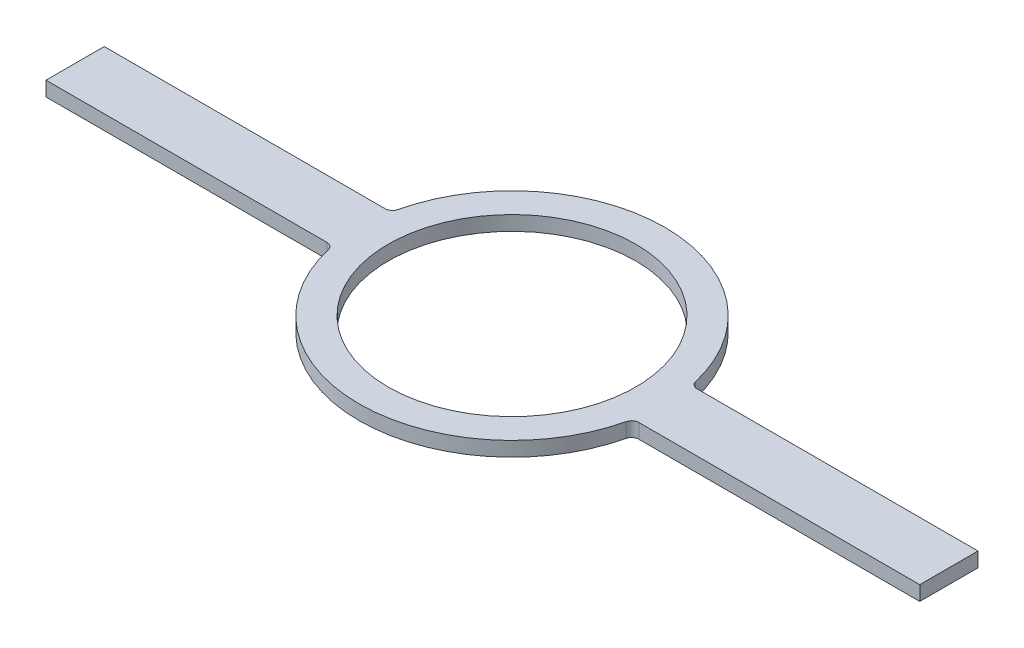
ISO-10303-21;
HEADER;
FILE_DESCRIPTION(('STEP AP214'),'2;1');
FILE_NAME('part.step','',(''),(''),'','','');
FILE_SCHEMA(('AUTOMOTIVE_DESIGN { 1 0 10303 214 1 1 1 1 }'));
ENDSEC;
DATA;
#1=APPLICATION_CONTEXT('core data for automotive mechanical design processes');
#2=APPLICATION_PROTOCOL_DEFINITION('international standard','automotive_design',2000,#1);
#3=PRODUCT_CONTEXT('',#1,'mechanical');
#4=PRODUCT('Part','Part','',(#3));
#5=PRODUCT_RELATED_PRODUCT_CATEGORY('part','',(#4));
#6=PRODUCT_DEFINITION_FORMATION('','',#4);
#7=PRODUCT_DEFINITION_CONTEXT('part definition',#1,'design');
#8=PRODUCT_DEFINITION('design','',#6,#7);
#9=PRODUCT_DEFINITION_SHAPE('','',#8);
#10=(LENGTH_UNIT() NAMED_UNIT(*) SI_UNIT(.MILLI.,.METRE.));
#11=(NAMED_UNIT(*) PLANE_ANGLE_UNIT() SI_UNIT($,.RADIAN.));
#12=(NAMED_UNIT(*) SI_UNIT($,.STERADIAN.) SOLID_ANGLE_UNIT());
#13=UNCERTAINTY_MEASURE_WITH_UNIT(LENGTH_MEASURE(1.E-05),#10,'distance_accuracy_value','');
#14=(GEOMETRIC_REPRESENTATION_CONTEXT(3) GLOBAL_UNCERTAINTY_ASSIGNED_CONTEXT((#13)) GLOBAL_UNIT_ASSIGNED_CONTEXT((#10,
#11,#12)) REPRESENTATION_CONTEXT('',''));
#15=CARTESIAN_POINT('',(0.,0.,0.));
#16=DIRECTION('',(0.,0.,1.));
#17=DIRECTION('',(1.,0.,0.));
#18=AXIS2_PLACEMENT_3D('',#15,#16,#17);
#19=CARTESIAN_POINT('',(0.,6.35,0.));
#20=DIRECTION('',(0.,1.,0.));
#21=DIRECTION('',(0.,0.,1.));
#22=AXIS2_PLACEMENT_3D('',#19,#20,#21);
#23=PLANE('',#22);
#24=CARTESIAN_POINT('',(0.,6.35,0.));
#25=DIRECTION('',(0.,1.,0.));
#26=DIRECTION('',(0.,0.,1.));
#27=AXIS2_PLACEMENT_3D('',#24,#25,#26);
#28=CIRCLE('',#27,66.675);
#29=CARTESIAN_POINT('',(-64.9301918826947,6.35,15.1534090909091));
#30=VERTEX_POINT('',#29);
#31=CARTESIAN_POINT('',(64.9301918826947,6.35,15.1534090909091));
#32=VERTEX_POINT('',#31);
#33=EDGE_CURVE('E264',#30,#32,#28,.T.);
#34=ORIENTED_EDGE('',*,*,#33,.T.);
#35=CARTESIAN_POINT('',(68.0221057818706,6.35,15.875));
#36=DIRECTION('',(0.,1.,0.));
#37=DIRECTION('',(0.,0.,1.));
#38=AXIS2_PLACEMENT_3D('',#35,#36,#37);
#39=CIRCLE('',#38,3.175);
#40=CARTESIAN_POINT('',(68.0221057818706,6.35,12.7));
#41=VERTEX_POINT('',#40);
#42=EDGE_CURVE('E129',#32,#41,#39,.F.);
#43=ORIENTED_EDGE('',*,*,#42,.T.);
#44=DIRECTION('',(1.,0.,0.));
#45=VECTOR('',#44,1.);
#46=CARTESIAN_POINT('',(65.4543018066803,6.35,12.7));
#47=LINE('',#46,#45);
#48=CARTESIAN_POINT('',(190.5,6.35,12.7));
#49=VERTEX_POINT('',#48);
#50=EDGE_CURVE('E121',#41,#49,#47,.T.);
#51=ORIENTED_EDGE('',*,*,#50,.T.);
#52=DIRECTION('',(0.,0.,-1.));
#53=VECTOR('',#52,1.);
#54=CARTESIAN_POINT('',(190.5,6.35,-12.7));
#55=LINE('',#54,#53);
#56=CARTESIAN_POINT('',(190.5,6.35,-12.7));
#57=VERTEX_POINT('',#56);
#58=EDGE_CURVE('E126',#49,#57,#55,.T.);
#59=ORIENTED_EDGE('',*,*,#58,.T.);
#60=DIRECTION('',(-1.,0.,0.));
#61=VECTOR('',#60,1.);
#62=CARTESIAN_POINT('',(65.4543018066804,6.35,-12.7));
#63=LINE('',#62,#61);
#64=CARTESIAN_POINT('',(68.0221057818707,6.35,-12.7));
#65=VERTEX_POINT('',#64);
#66=EDGE_CURVE('E143',#57,#65,#63,.T.);
#67=ORIENTED_EDGE('',*,*,#66,.T.);
#68=CARTESIAN_POINT('',(68.0221057818707,6.35,-15.875));
#69=DIRECTION('',(0.,1.,0.));
#70=DIRECTION('',(0.,0.,1.));
#71=AXIS2_PLACEMENT_3D('',#68,#69,#70);
#72=CIRCLE('',#71,3.175);
#73=CARTESIAN_POINT('',(64.9301918826947,6.35,-15.1534090909091));
#74=VERTEX_POINT('',#73);
#75=EDGE_CURVE('E178',#65,#74,#72,.F.);
#76=ORIENTED_EDGE('',*,*,#75,.T.);
#77=CARTESIAN_POINT('',(0.,6.35,0.));
#78=DIRECTION('',(0.,1.,0.));
#79=DIRECTION('',(0.,0.,1.));
#80=AXIS2_PLACEMENT_3D('',#77,#78,#79);
#81=CIRCLE('',#80,66.675);
#82=CARTESIAN_POINT('',(-64.9301918826947,6.35,-15.1534090909091));
#83=VERTEX_POINT('',#82);
#84=EDGE_CURVE('E252',#74,#83,#81,.T.);
#85=ORIENTED_EDGE('',*,*,#84,.T.);
#86=CARTESIAN_POINT('',(-68.0221057818707,6.35,-15.875));
#87=DIRECTION('',(0.,1.,0.));
#88=DIRECTION('',(0.,0.,1.));
#89=AXIS2_PLACEMENT_3D('',#86,#87,#88);
#90=CIRCLE('',#89,3.175);
#91=CARTESIAN_POINT('',(-68.0221057818707,6.35,-12.7));
#92=VERTEX_POINT('',#91);
#93=EDGE_CURVE('E174',#83,#92,#90,.F.);
#94=ORIENTED_EDGE('',*,*,#93,.T.);
#95=DIRECTION('',(-1.,0.,0.));
#96=VECTOR('',#95,1.);
#97=CARTESIAN_POINT('',(-190.5,6.35,-12.7));
#98=LINE('',#97,#96);
#99=CARTESIAN_POINT('',(-190.5,6.35,-12.7));
#100=VERTEX_POINT('',#99);
#101=EDGE_CURVE('E249',#92,#100,#98,.T.);
#102=ORIENTED_EDGE('',*,*,#101,.T.);
#103=DIRECTION('',(0.,0.,1.));
#104=VECTOR('',#103,1.);
#105=CARTESIAN_POINT('',(-190.5,6.35,-12.7));
#106=LINE('',#105,#104);
#107=CARTESIAN_POINT('',(-190.5,6.35,12.7));
#108=VERTEX_POINT('',#107);
#109=EDGE_CURVE('E256',#100,#108,#106,.T.);
#110=ORIENTED_EDGE('',*,*,#109,.T.);
#111=DIRECTION('',(1.,0.,0.));
#112=VECTOR('',#111,1.);
#113=CARTESIAN_POINT('',(-190.5,6.35,12.7));
#114=LINE('',#113,#112);
#115=CARTESIAN_POINT('',(-68.0221057818706,6.35,12.7));
#116=VERTEX_POINT('',#115);
#117=EDGE_CURVE('E258',#108,#116,#114,.T.);
#118=ORIENTED_EDGE('',*,*,#117,.T.);
#119=CARTESIAN_POINT('',(-68.0221057818706,6.35,15.875));
#120=DIRECTION('',(0.,1.,0.));
#121=DIRECTION('',(0.,0.,1.));
#122=AXIS2_PLACEMENT_3D('',#119,#120,#121);
#123=CIRCLE('',#122,3.175);
#124=EDGE_CURVE('E11',#116,#30,#123,.F.);
#125=ORIENTED_EDGE('',*,*,#124,.T.);
#126=EDGE_LOOP('',(#34,#43,#51,#59,#67,#76,#85,#94,#102,#110,#118,#125));
#127=FACE_BOUND('',#126,.T.);
#128=CARTESIAN_POINT('',(0.,6.35,0.));
#129=DIRECTION('',(0.,1.,0.));
#130=DIRECTION('',(0.,0.,1.));
#131=AXIS2_PLACEMENT_3D('',#128,#129,#130);
#132=CIRCLE('',#131,53.975);
#133=CARTESIAN_POINT('',(0.,6.35,53.975));
#134=VERTEX_POINT('',#133);
#135=EDGE_CURVE('E269',#134,#134,#132,.T.);
#136=ORIENTED_EDGE('',*,*,#135,.F.);
#137=EDGE_LOOP('',(#136));
#138=FACE_BOUND('',#137,.T.);
#139=ADVANCED_FACE('F33',(#127,#138),#23,.T.);
#140=CARTESIAN_POINT('',(0.,0.,0.));
#141=DIRECTION('',(0.,1.,0.));
#142=DIRECTION('',(0.,0.,1.));
#143=AXIS2_PLACEMENT_3D('',#140,#141,#142);
#144=PLANE('',#143);
#145=DIRECTION('',(1.,0.,0.));
#146=VECTOR('',#145,1.);
#147=CARTESIAN_POINT('',(65.4543018066803,0.,12.7));
#148=LINE('',#147,#146);
#149=CARTESIAN_POINT('',(68.0221057818706,0.,12.7));
#150=VERTEX_POINT('',#149);
#151=CARTESIAN_POINT('',(190.5,0.,12.7));
#152=VERTEX_POINT('',#151);
#153=EDGE_CURVE('E147',#150,#152,#148,.T.);
#154=ORIENTED_EDGE('',*,*,#153,.F.);
#155=CARTESIAN_POINT('',(68.0221057818706,0.,15.875));
#156=DIRECTION('',(0.,1.,0.));
#157=DIRECTION('',(0.,0.,1.));
#158=AXIS2_PLACEMENT_3D('',#155,#156,#157);
#159=CIRCLE('',#158,3.175);
#160=CARTESIAN_POINT('',(64.9301918826947,0.,15.1534090909091));
#161=VERTEX_POINT('',#160);
#162=EDGE_CURVE('E180',#150,#161,#159,.T.);
#163=ORIENTED_EDGE('',*,*,#162,.T.);
#164=CARTESIAN_POINT('',(0.,0.,0.));
#165=DIRECTION('',(0.,1.,0.));
#166=DIRECTION('',(0.,0.,1.));
#167=AXIS2_PLACEMENT_3D('',#164,#165,#166);
#168=CIRCLE('',#167,66.675);
#169=CARTESIAN_POINT('',(-64.9301918826947,0.,15.1534090909091));
#170=VERTEX_POINT('',#169);
#171=EDGE_CURVE('E134',#170,#161,#168,.T.);
#172=ORIENTED_EDGE('',*,*,#171,.F.);
#173=CARTESIAN_POINT('',(-68.0221057818706,0.,15.875));
#174=DIRECTION('',(0.,1.,0.));
#175=DIRECTION('',(0.,0.,1.));
#176=AXIS2_PLACEMENT_3D('',#173,#174,#175);
#177=CIRCLE('',#176,3.175);
#178=CARTESIAN_POINT('',(-68.0221057818706,0.,12.7));
#179=VERTEX_POINT('',#178);
#180=EDGE_CURVE('E41',#170,#179,#177,.T.);
#181=ORIENTED_EDGE('',*,*,#180,.T.);
#182=DIRECTION('',(1.,0.,0.));
#183=VECTOR('',#182,1.);
#184=CARTESIAN_POINT('',(-190.5,0.,12.7));
#185=LINE('',#184,#183);
#186=CARTESIAN_POINT('',(-190.5,0.,12.7));
#187=VERTEX_POINT('',#186);
#188=EDGE_CURVE('E191',#187,#179,#185,.T.);
#189=ORIENTED_EDGE('',*,*,#188,.F.);
#190=DIRECTION('',(0.,0.,1.));
#191=VECTOR('',#190,1.);
#192=CARTESIAN_POINT('',(-190.5,0.,-12.7));
#193=LINE('',#192,#191);
#194=CARTESIAN_POINT('',(-190.5,0.,-12.7));
#195=VERTEX_POINT('',#194);
#196=EDGE_CURVE('E279',#195,#187,#193,.T.);
#197=ORIENTED_EDGE('',*,*,#196,.F.);
#198=DIRECTION('',(-1.,0.,0.));
#199=VECTOR('',#198,1.);
#200=CARTESIAN_POINT('',(-190.5,0.,-12.7));
#201=LINE('',#200,#199);
#202=CARTESIAN_POINT('',(-68.0221057818707,0.,-12.7));
#203=VERTEX_POINT('',#202);
#204=EDGE_CURVE('E277',#203,#195,#201,.T.);
#205=ORIENTED_EDGE('',*,*,#204,.F.);
#206=CARTESIAN_POINT('',(-68.0221057818707,0.,-15.875));
#207=DIRECTION('',(0.,1.,0.));
#208=DIRECTION('',(0.,0.,1.));
#209=AXIS2_PLACEMENT_3D('',#206,#207,#208);
#210=CIRCLE('',#209,3.175);
#211=CARTESIAN_POINT('',(-64.9301918826947,0.,-15.1534090909091));
#212=VERTEX_POINT('',#211);
#213=EDGE_CURVE('E172',#203,#212,#210,.T.);
#214=ORIENTED_EDGE('',*,*,#213,.T.);
#215=CARTESIAN_POINT('',(0.,0.,0.));
#216=DIRECTION('',(0.,1.,0.));
#217=DIRECTION('',(0.,0.,1.));
#218=AXIS2_PLACEMENT_3D('',#215,#216,#217);
#219=CIRCLE('',#218,66.675);
#220=CARTESIAN_POINT('',(64.9301918826947,0.,-15.1534090909091));
#221=VERTEX_POINT('',#220);
#222=EDGE_CURVE('E274',#221,#212,#219,.T.);
#223=ORIENTED_EDGE('',*,*,#222,.F.);
#224=CARTESIAN_POINT('',(68.0221057818707,0.,-15.875));
#225=DIRECTION('',(0.,1.,0.));
#226=DIRECTION('',(0.,0.,1.));
#227=AXIS2_PLACEMENT_3D('',#224,#225,#226);
#228=CIRCLE('',#227,3.175);
#229=CARTESIAN_POINT('',(68.0221057818707,0.,-12.7));
#230=VERTEX_POINT('',#229);
#231=EDGE_CURVE('E176',#221,#230,#228,.T.);
#232=ORIENTED_EDGE('',*,*,#231,.T.);
#233=DIRECTION('',(-1.,0.,0.));
#234=VECTOR('',#233,1.);
#235=CARTESIAN_POINT('',(65.4543018066804,0.,-12.7));
#236=LINE('',#235,#234);
#237=CARTESIAN_POINT('',(190.5,0.,-12.7));
#238=VERTEX_POINT('',#237);
#239=EDGE_CURVE('E271',#238,#230,#236,.T.);
#240=ORIENTED_EDGE('',*,*,#239,.F.);
#241=DIRECTION('',(0.,0.,-1.));
#242=VECTOR('',#241,1.);
#243=CARTESIAN_POINT('',(190.5,0.,-12.7));
#244=LINE('',#243,#242);
#245=EDGE_CURVE('E268',#152,#238,#244,.T.);
#246=ORIENTED_EDGE('',*,*,#245,.F.);
#247=EDGE_LOOP('',(#154,#163,#172,#181,#189,#197,#205,#214,#223,#232,#240,#246));
#248=FACE_BOUND('',#247,.T.);
#249=CARTESIAN_POINT('',(0.,0.,0.));
#250=DIRECTION('',(0.,1.,0.));
#251=DIRECTION('',(0.,0.,1.));
#252=AXIS2_PLACEMENT_3D('',#249,#250,#251);
#253=CIRCLE('',#252,53.975);
#254=CARTESIAN_POINT('',(0.,0.,53.975));
#255=VERTEX_POINT('',#254);
#256=EDGE_CURVE('E292',#255,#255,#253,.T.);
#257=ORIENTED_EDGE('',*,*,#256,.T.);
#258=EDGE_LOOP('',(#257));
#259=FACE_BOUND('',#258,.T.);
#260=ADVANCED_FACE('F183',(#248,#259),#144,.F.);
#261=CARTESIAN_POINT('',(65.4543018066803,6.35,12.7));
#262=DIRECTION('',(0.,0.,-1.));
#263=DIRECTION('',(-1.,0.,0.));
#264=AXIS2_PLACEMENT_3D('',#261,#262,#263);
#265=PLANE('',#264);
#266=ORIENTED_EDGE('',*,*,#50,.F.);
#267=DIRECTION('',(0.,1.,0.));
#268=VECTOR('',#267,1.);
#269=CARTESIAN_POINT('',(68.0221057818706,0.,12.7));
#270=LINE('',#269,#268);
#271=EDGE_CURVE('E164',#41,#150,#270,.F.);
#272=ORIENTED_EDGE('',*,*,#271,.T.);
#273=ORIENTED_EDGE('',*,*,#153,.T.);
#274=DIRECTION('',(0.,-1.,0.));
#275=VECTOR('',#274,1.);
#276=CARTESIAN_POINT('',(190.5,6.35,12.7));
#277=LINE('',#276,#275);
#278=EDGE_CURVE('E139',#49,#152,#277,.T.);
#279=ORIENTED_EDGE('',*,*,#278,.F.);
#280=EDGE_LOOP('',(#266,#272,#273,#279));
#281=FACE_BOUND('',#280,.T.);
#282=ADVANCED_FACE('F145',(#281),#265,.F.);
#283=CARTESIAN_POINT('',(190.5,6.35,-12.7));
#284=DIRECTION('',(-1.,0.,0.));
#285=DIRECTION('',(0.,0.,1.));
#286=AXIS2_PLACEMENT_3D('',#283,#284,#285);
#287=PLANE('',#286);
#288=ORIENTED_EDGE('',*,*,#245,.T.);
#289=DIRECTION('',(0.,-1.,0.));
#290=VECTOR('',#289,1.);
#291=CARTESIAN_POINT('',(190.5,6.35,-12.7));
#292=LINE('',#291,#290);
#293=EDGE_CURVE('E141',#57,#238,#292,.T.);
#294=ORIENTED_EDGE('',*,*,#293,.F.);
#295=ORIENTED_EDGE('',*,*,#58,.F.);
#296=ORIENTED_EDGE('',*,*,#278,.T.);
#297=EDGE_LOOP('',(#288,#294,#295,#296));
#298=FACE_BOUND('',#297,.T.);
#299=ADVANCED_FACE('F138',(#298),#287,.F.);
#300=CARTESIAN_POINT('',(65.4543018066804,6.35,-12.7));
#301=DIRECTION('',(0.,0.,1.));
#302=DIRECTION('',(1.,0.,0.));
#303=AXIS2_PLACEMENT_3D('',#300,#301,#302);
#304=PLANE('',#303);
#305=ORIENTED_EDGE('',*,*,#239,.T.);
#306=DIRECTION('',(0.,1.,0.));
#307=VECTOR('',#306,1.);
#308=CARTESIAN_POINT('',(68.0221057818707,6.35,-12.7));
#309=LINE('',#308,#307);
#310=EDGE_CURVE('E162',#230,#65,#309,.T.);
#311=ORIENTED_EDGE('',*,*,#310,.T.);
#312=ORIENTED_EDGE('',*,*,#66,.F.);
#313=ORIENTED_EDGE('',*,*,#293,.T.);
#314=EDGE_LOOP('',(#305,#311,#312,#313));
#315=FACE_BOUND('',#314,.T.);
#316=ADVANCED_FACE('F229',(#315),#304,.F.);
#317=CARTESIAN_POINT('',(0.,6.35,0.));
#318=DIRECTION('',(0.,-1.,0.));
#319=DIRECTION('',(0.,0.,-1.));
#320=AXIS2_PLACEMENT_3D('',#317,#318,#319);
#321=CYLINDRICAL_SURFACE('',#320,66.675);
#322=ORIENTED_EDGE('',*,*,#222,.T.);
#323=DIRECTION('',(0.,-1.,0.));
#324=VECTOR('',#323,1.);
#325=CARTESIAN_POINT('',(-64.9301918826947,6.35,-15.1534090909091));
#326=LINE('',#325,#324);
#327=EDGE_CURVE('E160',#212,#83,#326,.F.);
#328=ORIENTED_EDGE('',*,*,#327,.T.);
#329=ORIENTED_EDGE('',*,*,#84,.F.);
#330=DIRECTION('',(0.,-1.,0.));
#331=VECTOR('',#330,1.);
#332=CARTESIAN_POINT('',(64.9301918826947,6.35,-15.1534090909091));
#333=LINE('',#332,#331);
#334=EDGE_CURVE('E152',#74,#221,#333,.T.);
#335=ORIENTED_EDGE('',*,*,#334,.T.);
#336=EDGE_LOOP('',(#322,#328,#329,#335));
#337=FACE_BOUND('',#336,.T.);
#338=ADVANCED_FACE('F225',(#337),#321,.T.);
#339=CARTESIAN_POINT('',(-190.5,6.35,-12.7));
#340=DIRECTION('',(0.,0.,1.));
#341=DIRECTION('',(1.,0.,0.));
#342=AXIS2_PLACEMENT_3D('',#339,#340,#341);
#343=PLANE('',#342);
#344=ORIENTED_EDGE('',*,*,#101,.F.);
#345=DIRECTION('',(0.,1.,0.));
#346=VECTOR('',#345,1.);
#347=CARTESIAN_POINT('',(-68.0221057818707,0.,-12.7));
#348=LINE('',#347,#346);
#349=EDGE_CURVE('E149',#92,#203,#348,.F.);
#350=ORIENTED_EDGE('',*,*,#349,.T.);
#351=ORIENTED_EDGE('',*,*,#204,.T.);
#352=DIRECTION('',(0.,-1.,0.));
#353=VECTOR('',#352,1.);
#354=CARTESIAN_POINT('',(-190.5,6.35,-12.7));
#355=LINE('',#354,#353);
#356=EDGE_CURVE('E154',#100,#195,#355,.T.);
#357=ORIENTED_EDGE('',*,*,#356,.F.);
#358=EDGE_LOOP('',(#344,#350,#351,#357));
#359=FACE_BOUND('',#358,.T.);
#360=ADVANCED_FACE('F221',(#359),#343,.F.);
#361=CARTESIAN_POINT('',(-190.5,6.35,-12.7));
#362=DIRECTION('',(1.,0.,0.));
#363=DIRECTION('',(0.,0.,-1.));
#364=AXIS2_PLACEMENT_3D('',#361,#362,#363);
#365=PLANE('',#364);
#366=ORIENTED_EDGE('',*,*,#196,.T.);
#367=DIRECTION('',(0.,-1.,0.));
#368=VECTOR('',#367,1.);
#369=CARTESIAN_POINT('',(-190.5,6.35,12.7));
#370=LINE('',#369,#368);
#371=EDGE_CURVE('E266',#108,#187,#370,.T.);
#372=ORIENTED_EDGE('',*,*,#371,.F.);
#373=ORIENTED_EDGE('',*,*,#109,.F.);
#374=ORIENTED_EDGE('',*,*,#356,.T.);
#375=EDGE_LOOP('',(#366,#372,#373,#374));
#376=FACE_BOUND('',#375,.T.);
#377=ADVANCED_FACE('F218',(#376),#365,.F.);
#378=CARTESIAN_POINT('',(-190.5,6.35,12.7));
#379=DIRECTION('',(0.,0.,-1.));
#380=DIRECTION('',(-1.,0.,0.));
#381=AXIS2_PLACEMENT_3D('',#378,#379,#380);
#382=PLANE('',#381);
#383=ORIENTED_EDGE('',*,*,#188,.T.);
#384=DIRECTION('',(0.,1.,0.));
#385=VECTOR('',#384,1.);
#386=CARTESIAN_POINT('',(-68.0221057818706,6.35,12.7));
#387=LINE('',#386,#385);
#388=EDGE_CURVE('E48',#179,#116,#387,.T.);
#389=ORIENTED_EDGE('',*,*,#388,.T.);
#390=ORIENTED_EDGE('',*,*,#117,.F.);
#391=ORIENTED_EDGE('',*,*,#371,.T.);
#392=EDGE_LOOP('',(#383,#389,#390,#391));
#393=FACE_BOUND('',#392,.T.);
#394=ADVANCED_FACE('F215',(#393),#382,.F.);
#395=CARTESIAN_POINT('',(0.,6.35,0.));
#396=DIRECTION('',(0.,-1.,0.));
#397=DIRECTION('',(0.,0.,-1.));
#398=AXIS2_PLACEMENT_3D('',#395,#396,#397);
#399=CYLINDRICAL_SURFACE('',#398,66.675);
#400=ORIENTED_EDGE('',*,*,#171,.T.);
#401=DIRECTION('',(0.,-1.,0.));
#402=VECTOR('',#401,1.);
#403=CARTESIAN_POINT('',(64.9301918826947,6.35,15.1534090909091));
#404=LINE('',#403,#402);
#405=EDGE_CURVE('E169',#161,#32,#404,.F.);
#406=ORIENTED_EDGE('',*,*,#405,.T.);
#407=ORIENTED_EDGE('',*,*,#33,.F.);
#408=DIRECTION('',(0.,-1.,0.));
#409=VECTOR('',#408,1.);
#410=CARTESIAN_POINT('',(-64.9301918826947,6.35,15.1534090909091));
#411=LINE('',#410,#409);
#412=EDGE_CURVE('E166',#30,#170,#411,.T.);
#413=ORIENTED_EDGE('',*,*,#412,.T.);
#414=EDGE_LOOP('',(#400,#406,#407,#413));
#415=FACE_BOUND('',#414,.T.);
#416=ADVANCED_FACE('F188',(#415),#399,.T.);
#417=CARTESIAN_POINT('',(0.,6.35,0.));
#418=DIRECTION('',(0.,-1.,0.));
#419=DIRECTION('',(0.,0.,-1.));
#420=AXIS2_PLACEMENT_3D('',#417,#418,#419);
#421=CYLINDRICAL_SURFACE('',#420,53.975);
#422=ORIENTED_EDGE('',*,*,#135,.T.);
#423=EDGE_LOOP('',(#422));
#424=FACE_BOUND('',#423,.T.);
#425=ORIENTED_EDGE('',*,*,#256,.F.);
#426=EDGE_LOOP('',(#425));
#427=FACE_BOUND('',#426,.T.);
#428=ADVANCED_FACE('F211',(#424,#427),#421,.F.);
#429=CARTESIAN_POINT('',(-68.0221057818707,6.35,-15.875));
#430=DIRECTION('',(0.,-1.,0.));
#431=DIRECTION('',(0.,0.,-1.));
#432=AXIS2_PLACEMENT_3D('',#429,#430,#431);
#433=CYLINDRICAL_SURFACE('',#432,3.175);
#434=ORIENTED_EDGE('',*,*,#93,.F.);
#435=ORIENTED_EDGE('',*,*,#327,.F.);
#436=ORIENTED_EDGE('',*,*,#213,.F.);
#437=ORIENTED_EDGE('',*,*,#349,.F.);
#438=EDGE_LOOP('',(#434,#435,#436,#437));
#439=FACE_BOUND('',#438,.T.);
#440=ADVANCED_FACE('F201',(#439),#433,.F.);
#441=CARTESIAN_POINT('',(68.0221057818707,6.35,-15.875));
#442=DIRECTION('',(0.,-1.,0.));
#443=DIRECTION('',(0.,0.,-1.));
#444=AXIS2_PLACEMENT_3D('',#441,#442,#443);
#445=CYLINDRICAL_SURFACE('',#444,3.175);
#446=ORIENTED_EDGE('',*,*,#75,.F.);
#447=ORIENTED_EDGE('',*,*,#310,.F.);
#448=ORIENTED_EDGE('',*,*,#231,.F.);
#449=ORIENTED_EDGE('',*,*,#334,.F.);
#450=EDGE_LOOP('',(#446,#447,#448,#449));
#451=FACE_BOUND('',#450,.T.);
#452=ADVANCED_FACE('F195',(#451),#445,.F.);
#453=CARTESIAN_POINT('',(68.0221057818706,6.35,15.875));
#454=DIRECTION('',(0.,-1.,0.));
#455=DIRECTION('',(0.,0.,-1.));
#456=AXIS2_PLACEMENT_3D('',#453,#454,#455);
#457=CYLINDRICAL_SURFACE('',#456,3.175);
#458=ORIENTED_EDGE('',*,*,#42,.F.);
#459=ORIENTED_EDGE('',*,*,#405,.F.);
#460=ORIENTED_EDGE('',*,*,#162,.F.);
#461=ORIENTED_EDGE('',*,*,#271,.F.);
#462=EDGE_LOOP('',(#458,#459,#460,#461));
#463=FACE_BOUND('',#462,.T.);
#464=ADVANCED_FACE('F193',(#463),#457,.F.);
#465=CARTESIAN_POINT('',(-68.0221057818706,6.35,15.875));
#466=DIRECTION('',(0.,-1.,0.));
#467=DIRECTION('',(0.,0.,-1.));
#468=AXIS2_PLACEMENT_3D('',#465,#466,#467);
#469=CYLINDRICAL_SURFACE('',#468,3.175);
#470=ORIENTED_EDGE('',*,*,#124,.F.);
#471=ORIENTED_EDGE('',*,*,#388,.F.);
#472=ORIENTED_EDGE('',*,*,#180,.F.);
#473=ORIENTED_EDGE('',*,*,#412,.F.);
#474=EDGE_LOOP('',(#470,#471,#472,#473));
#475=FACE_BOUND('',#474,.T.);
#476=ADVANCED_FACE('F35',(#475),#469,.F.);
#477=CLOSED_SHELL('',(#139,#260,#282,#299,#316,#338,#360,#377,#394,#416,#428,#440,#452,#464,#476));
#478=MANIFOLD_SOLID_BREP('B2',#477);
#479=ADVANCED_BREP_SHAPE_REPRESENTATION('',(#18,#478),#14);
#480=SHAPE_DEFINITION_REPRESENTATION(#9,#479);
ENDSEC;
END-ISO-10303-21;
